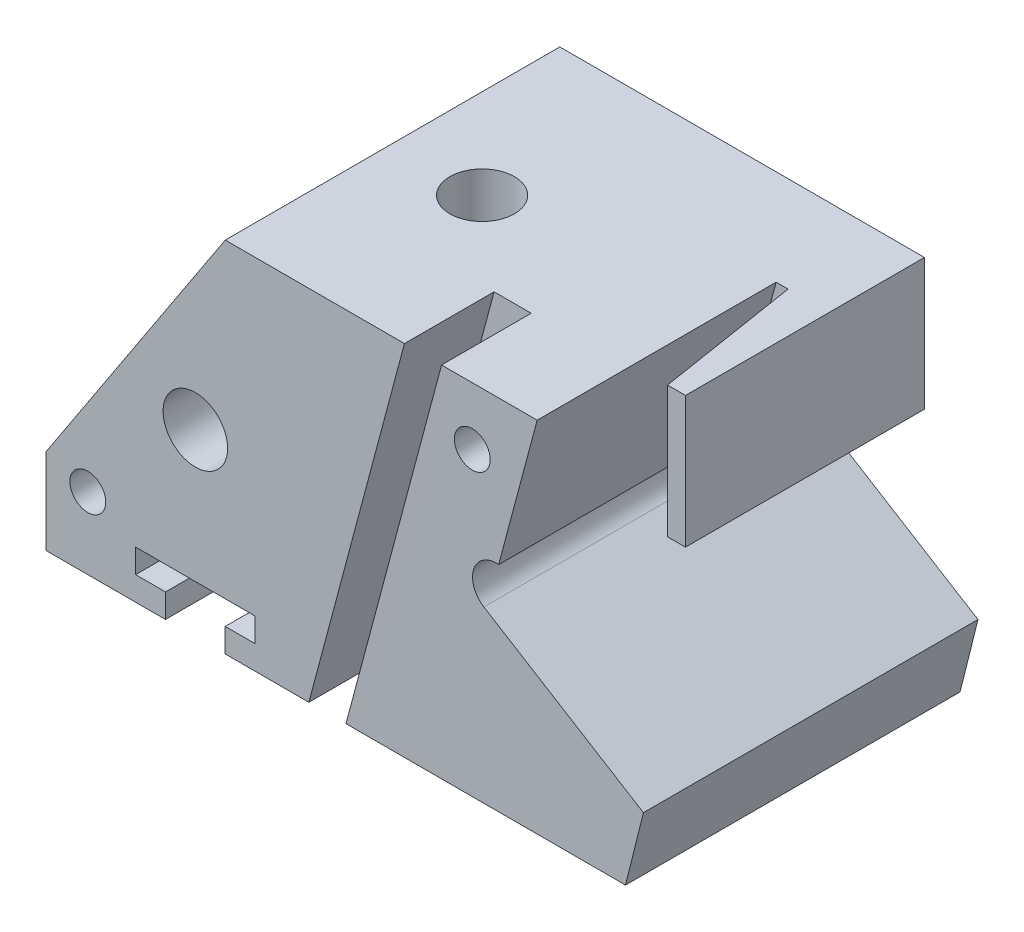
ISO-10303-21;
HEADER;
FILE_DESCRIPTION(('STEP AP214'),'2;1');
FILE_NAME('part.step','',(''),(''),'','','');
FILE_SCHEMA(('AUTOMOTIVE_DESIGN { 1 0 10303 214 1 1 1 1 }'));
ENDSEC;
DATA;
#1=APPLICATION_CONTEXT('core data for automotive mechanical design processes');
#2=APPLICATION_PROTOCOL_DEFINITION('international standard','automotive_design',2000,#1);
#3=PRODUCT_CONTEXT('',#1,'mechanical');
#4=PRODUCT('Part','Part','',(#3));
#5=PRODUCT_RELATED_PRODUCT_CATEGORY('part','',(#4));
#6=PRODUCT_DEFINITION_FORMATION('','',#4);
#7=PRODUCT_DEFINITION_CONTEXT('part definition',#1,'design');
#8=PRODUCT_DEFINITION('design','',#6,#7);
#9=PRODUCT_DEFINITION_SHAPE('','',#8);
#10=(LENGTH_UNIT() NAMED_UNIT(*) SI_UNIT(.MILLI.,.METRE.));
#11=(NAMED_UNIT(*) PLANE_ANGLE_UNIT() SI_UNIT($,.RADIAN.));
#12=(NAMED_UNIT(*) SI_UNIT($,.STERADIAN.) SOLID_ANGLE_UNIT());
#13=UNCERTAINTY_MEASURE_WITH_UNIT(LENGTH_MEASURE(1.E-05),#10,'distance_accuracy_value','');
#14=(GEOMETRIC_REPRESENTATION_CONTEXT(3) GLOBAL_UNCERTAINTY_ASSIGNED_CONTEXT((#13)) GLOBAL_UNIT_ASSIGNED_CONTEXT((#10,
#11,#12)) REPRESENTATION_CONTEXT('',''));
#15=CARTESIAN_POINT('',(0.,0.,0.));
#16=DIRECTION('',(0.,0.,1.));
#17=DIRECTION('',(1.,0.,0.));
#18=AXIS2_PLACEMENT_3D('',#15,#16,#17);
#19=CARTESIAN_POINT('',(0.,58.6840760891297,-56.));
#20=DIRECTION('',(0.,-1.,0.));
#21=DIRECTION('',(0.,0.,-1.));
#22=AXIS2_PLACEMENT_3D('',#19,#20,#21);
#23=PLANE('',#22);
#24=DIRECTION('',(-1.,0.,0.));
#25=VECTOR('',#24,1.);
#26=CARTESIAN_POINT('',(-36.1773474609924,58.6840760891297,-40.));
#27=LINE('',#26,#25);
#28=CARTESIAN_POINT('',(-36.1773474609924,58.6840760891297,-40.));
#29=VERTEX_POINT('',#28);
#30=CARTESIAN_POINT('',(-44.044014127659,58.6840760891297,-40.));
#31=VERTEX_POINT('',#30);
#32=EDGE_CURVE('E550',#29,#31,#27,.T.);
#33=ORIENTED_EDGE('',*,*,#32,.T.);
#34=DIRECTION('',(0.,0.,1.));
#35=VECTOR('',#34,1.);
#36=CARTESIAN_POINT('',(-44.044014127659,58.6840760891297,-56.));
#37=LINE('',#36,#35);
#38=CARTESIAN_POINT('',(-44.044014127659,58.6840760891297,-56.));
#39=VERTEX_POINT('',#38);
#40=EDGE_CURVE('E219',#39,#31,#37,.T.);
#41=ORIENTED_EDGE('',*,*,#40,.F.);
#42=DIRECTION('',(1.,0.,0.));
#43=VECTOR('',#42,1.);
#44=CARTESIAN_POINT('',(0.,58.6840760891297,-56.));
#45=LINE('',#44,#43);
#46=CARTESIAN_POINT('',(-29.3509749201579,58.6840760891297,-56.));
#47=VERTEX_POINT('',#46);
#48=EDGE_CURVE('E67',#39,#47,#45,.T.);
#49=ORIENTED_EDGE('',*,*,#48,.T.);
#50=DIRECTION('',(0.,0.,1.));
#51=VECTOR('',#50,1.);
#52=CARTESIAN_POINT('',(-29.3509749201579,58.6840760891297,-56.));
#53=LINE('',#52,#51);
#54=CARTESIAN_POINT('',(-29.3509749201579,58.6840760891297,-16.));
#55=VERTEX_POINT('',#54);
#56=EDGE_CURVE('E258',#47,#55,#53,.T.);
#57=ORIENTED_EDGE('',*,*,#56,.T.);
#58=DIRECTION('',(-1.,0.,0.));
#59=VECTOR('',#58,1.);
#60=CARTESIAN_POINT('',(-29.3509749201579,58.6840760891297,-16.));
#61=LINE('',#60,#59);
#62=CARTESIAN_POINT('',(-32.3509749201579,58.6840760891297,-16.));
#63=VERTEX_POINT('',#62);
#64=EDGE_CURVE('E59',#55,#63,#61,.T.);
#65=ORIENTED_EDGE('',*,*,#64,.T.);
#66=DIRECTION('',(-0.157443744207522,0.,-0.98752795778647));
#67=VECTOR('',#66,1.);
#68=CARTESIAN_POINT('',(-32.3509749201579,58.6840760891297,-16.));
#69=LINE('',#68,#67);
#70=EDGE_CURVE('E222',#63,#29,#69,.T.);
#71=ORIENTED_EDGE('',*,*,#70,.T.);
#72=EDGE_LOOP('',(#33,#41,#49,#57,#65,#71));
#73=FACE_BOUND('',#72,.T.);
#74=ADVANCED_FACE('F41',(#73),#23,.T.);
#75=CARTESIAN_POINT('',(0.,0.,0.));
#76=DIRECTION('',(0.,0.,1.));
#77=DIRECTION('',(1.,0.,0.));
#78=AXIS2_PLACEMENT_3D('',#75,#76,#77);
#79=PLANE('',#78);
#80=CARTESIAN_POINT('',(-49.033533804601,71.0217266931172,0.));
#81=DIRECTION('',(0.,0.,1.));
#82=DIRECTION('',(1.,0.,0.));
#83=AXIS2_PLACEMENT_3D('',#80,#81,#82);
#84=CIRCLE('',#83,2.99999999999999);
#85=CARTESIAN_POINT('',(-46.033533804601,71.0217266931172,0.));
#86=VERTEX_POINT('',#85);
#87=EDGE_CURVE('E867',#86,#86,#84,.T.);
#88=ORIENTED_EDGE('',*,*,#87,.F.);
#89=EDGE_LOOP('',(#88));
#90=FACE_BOUND('',#89,.T.);
#91=DIRECTION('',(-0.257662650560332,-0.966234939601246,0.));
#92=VECTOR('',#91,1.);
#93=CARTESIAN_POINT('',(-55.7300736268509,14.8613529671602,0.));
#94=LINE('',#93,#92);
#95=CARTESIAN_POINT('',(-38.1773474609924,80.6840760891297,0.));
#96=VERTEX_POINT('',#95);
#97=CARTESIAN_POINT('',(-44.6189137250007,56.5282025990985,0.));
#98=VERTEX_POINT('',#97);
#99=EDGE_CURVE('E386',#96,#98,#94,.T.);
#100=ORIENTED_EDGE('',*,*,#99,.F.);
#101=DIRECTION('',(1.,0.,0.));
#102=VECTOR('',#101,1.);
#103=CARTESIAN_POINT('',(0.,80.6840760891297,0.));
#104=LINE('',#103,#102);
#105=CARTESIAN_POINT('',(-54.1773474609924,80.6840760891297,0.));
#106=VERTEX_POINT('',#105);
#107=EDGE_CURVE('E239',#106,#96,#104,.T.);
#108=ORIENTED_EDGE('',*,*,#107,.F.);
#109=DIRECTION('',(-0.257662650560332,-0.966234939601246,0.));
#110=VECTOR('',#109,1.);
#111=CARTESIAN_POINT('',(-70.6678329629505,18.8447554567868,0.));
#112=LINE('',#111,#110);
#113=CARTESIAN_POINT('',(-70.1773474609924,20.6840760891297,0.));
#114=VERTEX_POINT('',#113);
#115=EDGE_CURVE('E276',#106,#114,#112,.T.);
#116=ORIENTED_EDGE('',*,*,#115,.T.);
#117=DIRECTION('',(1.,0.,0.));
#118=VECTOR('',#117,1.);
#119=CARTESIAN_POINT('',(0.,20.6840760891297,0.));
#120=LINE('',#119,#118);
#121=CARTESIAN_POINT('',(-23.3870173394964,20.6840760891297,0.));
#122=VERTEX_POINT('',#121);
#123=EDGE_CURVE('E369',#114,#122,#120,.T.);
#124=ORIENTED_EDGE('',*,*,#123,.T.);
#125=DIRECTION('',(0.242535625036333,0.970142500145332,0.));
#126=VECTOR('',#125,1.);
#127=CARTESIAN_POINT('',(-26.8781518699095,6.71953796747736,0.));
#128=LINE('',#127,#126);
#129=CARTESIAN_POINT('',(-20.3870173394964,32.6840760891297,0.));
#130=VERTEX_POINT('',#129);
#131=EDGE_CURVE('E374',#122,#130,#128,.T.);
#132=ORIENTED_EDGE('',*,*,#131,.T.);
#133=DIRECTION('',(-0.851357419747515,0.524586069049545,0.));
#134=VECTOR('',#133,1.);
#135=CARTESIAN_POINT('',(8.98672874869625,14.5846766638751,0.));
#136=LINE('',#135,#134);
#137=CARTESIAN_POINT('',(-47.0945264642916,49.1406041006389,0.));
#138=VERTEX_POINT('',#137);
#139=EDGE_CURVE('E378',#130,#138,#136,.T.);
#140=ORIENTED_EDGE('',*,*,#139,.T.);
#141=CARTESIAN_POINT('',(-44.9961821880934,52.5460337796289,0.));
#142=DIRECTION('',(0.,0.,1.));
#143=DIRECTION('',(1.,0.,0.));
#144=AXIS2_PLACEMENT_3D('',#141,#142,#143);
#145=CIRCLE('',#144,4.);
#146=EDGE_CURVE('E382',#98,#138,#145,.T.);
#147=ORIENTED_EDGE('',*,*,#146,.F.);
#148=EDGE_LOOP('',(#100,#108,#116,#124,#132,#140,#147));
#149=FACE_BOUND('',#148,.T.);
#150=ADVANCED_FACE('F493',(#90,#149),#79,.T.);
#151=CARTESIAN_POINT('',(-90.3870173394964,0.,-56.));
#152=DIRECTION('',(-1.,0.,0.));
#153=DIRECTION('',(0.,0.,1.));
#154=AXIS2_PLACEMENT_3D('',#151,#152,#153);
#155=PLANE('',#154);
#156=DIRECTION('',(0.,-1.,0.));
#157=VECTOR('',#156,1.);
#158=CARTESIAN_POINT('',(-90.3870173394964,0.,0.));
#159=LINE('',#158,#157);
#160=CARTESIAN_POINT('',(-90.3870173394964,24.6840760891297,0.));
#161=VERTEX_POINT('',#160);
#162=CARTESIAN_POINT('',(-90.3870173394964,20.6840760891297,0.));
#163=VERTEX_POINT('',#162);
#164=EDGE_CURVE('E296',#161,#163,#159,.T.);
#165=ORIENTED_EDGE('',*,*,#164,.F.);
#166=DIRECTION('',(0.,0.,1.));
#167=VECTOR('',#166,1.);
#168=CARTESIAN_POINT('',(-90.3870173394964,24.6840760891297,-56.));
#169=LINE('',#168,#167);
#170=CARTESIAN_POINT('',(-90.3870173394964,24.6840760891297,-56.));
#171=VERTEX_POINT('',#170);
#172=EDGE_CURVE('E11',#171,#161,#169,.T.);
#173=ORIENTED_EDGE('',*,*,#172,.F.);
#174=DIRECTION('',(0.,-1.,0.));
#175=VECTOR('',#174,1.);
#176=CARTESIAN_POINT('',(-90.3870173394964,0.,-56.));
#177=LINE('',#176,#175);
#178=CARTESIAN_POINT('',(-90.3870173394964,20.6840760891297,-56.));
#179=VERTEX_POINT('',#178);
#180=EDGE_CURVE('E306',#171,#179,#177,.T.);
#181=ORIENTED_EDGE('',*,*,#180,.T.);
#182=DIRECTION('',(0.,0.,1.));
#183=VECTOR('',#182,1.);
#184=CARTESIAN_POINT('',(-90.3870173394964,20.6840760891297,-56.));
#185=LINE('',#184,#183);
#186=EDGE_CURVE('E45',#179,#163,#185,.T.);
#187=ORIENTED_EDGE('',*,*,#186,.T.);
#188=EDGE_LOOP('',(#165,#173,#181,#187));
#189=FACE_BOUND('',#188,.T.);
#190=ADVANCED_FACE('F43',(#189),#155,.T.);
#191=CARTESIAN_POINT('',(0.,24.6840760891297,-56.));
#192=DIRECTION('',(0.,1.,0.));
#193=DIRECTION('',(0.,0.,1.));
#194=AXIS2_PLACEMENT_3D('',#191,#192,#193);
#195=PLANE('',#194);
#196=DIRECTION('',(-1.,0.,0.));
#197=VECTOR('',#196,1.);
#198=CARTESIAN_POINT('',(0.,24.6840760891297,0.));
#199=LINE('',#198,#197);
#200=CARTESIAN_POINT('',(-85.3870173394964,24.6840760891297,0.));
#201=VERTEX_POINT('',#200);
#202=EDGE_CURVE('E311',#201,#161,#199,.T.);
#203=ORIENTED_EDGE('',*,*,#202,.F.);
#204=DIRECTION('',(0.,0.,1.));
#205=VECTOR('',#204,1.);
#206=CARTESIAN_POINT('',(-85.3870173394964,24.6840760891297,-56.));
#207=LINE('',#206,#205);
#208=CARTESIAN_POINT('',(-85.3870173394964,24.6840760891297,-56.));
#209=VERTEX_POINT('',#208);
#210=EDGE_CURVE('E51',#209,#201,#207,.T.);
#211=ORIENTED_EDGE('',*,*,#210,.F.);
#212=DIRECTION('',(-1.,0.,0.));
#213=VECTOR('',#212,1.);
#214=CARTESIAN_POINT('',(0.,24.6840760891297,-56.));
#215=LINE('',#214,#213);
#216=EDGE_CURVE('E362',#209,#171,#215,.T.);
#217=ORIENTED_EDGE('',*,*,#216,.T.);
#218=ORIENTED_EDGE('',*,*,#172,.T.);
#219=EDGE_LOOP('',(#203,#211,#217,#218));
#220=FACE_BOUND('',#219,.T.);
#221=ADVANCED_FACE('F483',(#220),#195,.T.);
#222=CARTESIAN_POINT('',(-85.3870173394963,-2.96245727044926E-13,-56.));
#223=DIRECTION('',(-1.,0.,0.));
#224=DIRECTION('',(0.,-1.,0.));
#225=AXIS2_PLACEMENT_3D('',#222,#223,#224);
#226=PLANE('',#225);
#227=DIRECTION('',(0.,-1.,0.));
#228=VECTOR('',#227,1.);
#229=CARTESIAN_POINT('',(-85.3870173394963,-2.96245727044926E-13,0.));
#230=LINE('',#229,#228);
#231=CARTESIAN_POINT('',(-85.3870173394964,28.6840760891297,0.));
#232=VERTEX_POINT('',#231);
#233=EDGE_CURVE('E419',#232,#201,#230,.T.);
#234=ORIENTED_EDGE('',*,*,#233,.F.);
#235=DIRECTION('',(0.,0.,1.));
#236=VECTOR('',#235,1.);
#237=CARTESIAN_POINT('',(-85.3870173394964,28.6840760891297,-56.));
#238=LINE('',#237,#236);
#239=CARTESIAN_POINT('',(-85.3870173394964,28.6840760891297,-56.));
#240=VERTEX_POINT('',#239);
#241=EDGE_CURVE('E428',#240,#232,#238,.T.);
#242=ORIENTED_EDGE('',*,*,#241,.F.);
#243=DIRECTION('',(0.,-1.,0.));
#244=VECTOR('',#243,1.);
#245=CARTESIAN_POINT('',(-85.3870173394963,-2.96245727044926E-13,-56.));
#246=LINE('',#245,#244);
#247=EDGE_CURVE('E358',#240,#209,#246,.T.);
#248=ORIENTED_EDGE('',*,*,#247,.T.);
#249=ORIENTED_EDGE('',*,*,#210,.T.);
#250=EDGE_LOOP('',(#234,#242,#248,#249));
#251=FACE_BOUND('',#250,.T.);
#252=ADVANCED_FACE('F540',(#251),#226,.T.);
#253=CARTESIAN_POINT('',(0.,28.6840760891297,-56.));
#254=DIRECTION('',(0.,-1.,0.));
#255=DIRECTION('',(1.,0.,0.));
#256=AXIS2_PLACEMENT_3D('',#253,#254,#255);
#257=PLANE('',#256);
#258=DIRECTION('',(1.,0.,0.));
#259=VECTOR('',#258,1.);
#260=CARTESIAN_POINT('',(0.,28.6840760891297,0.));
#261=LINE('',#260,#259);
#262=CARTESIAN_POINT('',(-105.387017339496,28.6840760891297,0.));
#263=VERTEX_POINT('',#262);
#264=EDGE_CURVE('E415',#263,#232,#261,.T.);
#265=ORIENTED_EDGE('',*,*,#264,.F.);
#266=DIRECTION('',(0.,0.,1.));
#267=VECTOR('',#266,1.);
#268=CARTESIAN_POINT('',(-105.387017339496,28.6840760891297,-56.));
#269=LINE('',#268,#267);
#270=CARTESIAN_POINT('',(-105.387017339496,28.6840760891297,-56.));
#271=VERTEX_POINT('',#270);
#272=EDGE_CURVE('E431',#271,#263,#269,.T.);
#273=ORIENTED_EDGE('',*,*,#272,.F.);
#274=DIRECTION('',(1.,0.,0.));
#275=VECTOR('',#274,1.);
#276=CARTESIAN_POINT('',(0.,28.6840760891297,-56.));
#277=LINE('',#276,#275);
#278=EDGE_CURVE('E354',#271,#240,#277,.T.);
#279=ORIENTED_EDGE('',*,*,#278,.T.);
#280=ORIENTED_EDGE('',*,*,#241,.T.);
#281=EDGE_LOOP('',(#265,#273,#279,#280));
#282=FACE_BOUND('',#281,.T.);
#283=ADVANCED_FACE('F537',(#282),#257,.T.);
#284=CARTESIAN_POINT('',(-105.387017339496,3.65634666083999E-13,-56.));
#285=DIRECTION('',(1.,0.,0.));
#286=DIRECTION('',(0.,1.,0.));
#287=AXIS2_PLACEMENT_3D('',#284,#285,#286);
#288=PLANE('',#287);
#289=DIRECTION('',(0.,1.,0.));
#290=VECTOR('',#289,1.);
#291=CARTESIAN_POINT('',(-105.387017339496,3.65634666083999E-13,0.));
#292=LINE('',#291,#290);
#293=CARTESIAN_POINT('',(-105.387017339496,24.6840760891297,0.));
#294=VERTEX_POINT('',#293);
#295=EDGE_CURVE('E411',#294,#263,#292,.T.);
#296=ORIENTED_EDGE('',*,*,#295,.F.);
#297=DIRECTION('',(0.,0.,1.));
#298=VECTOR('',#297,1.);
#299=CARTESIAN_POINT('',(-105.387017339496,24.6840760891297,-56.));
#300=LINE('',#299,#298);
#301=CARTESIAN_POINT('',(-105.387017339496,24.6840760891297,-56.));
#302=VERTEX_POINT('',#301);
#303=EDGE_CURVE('E434',#302,#294,#300,.T.);
#304=ORIENTED_EDGE('',*,*,#303,.F.);
#305=DIRECTION('',(0.,1.,0.));
#306=VECTOR('',#305,1.);
#307=CARTESIAN_POINT('',(-105.387017339496,3.65634666083999E-13,-56.));
#308=LINE('',#307,#306);
#309=EDGE_CURVE('E350',#302,#271,#308,.T.);
#310=ORIENTED_EDGE('',*,*,#309,.T.);
#311=ORIENTED_EDGE('',*,*,#272,.T.);
#312=EDGE_LOOP('',(#296,#304,#310,#311));
#313=FACE_BOUND('',#312,.T.);
#314=ADVANCED_FACE('F534',(#313),#288,.T.);
#315=CARTESIAN_POINT('',(0.,24.6840760891297,-56.));
#316=DIRECTION('',(0.,1.,0.));
#317=DIRECTION('',(0.,0.,1.));
#318=AXIS2_PLACEMENT_3D('',#315,#316,#317);
#319=PLANE('',#318);
#320=DIRECTION('',(-1.,0.,0.));
#321=VECTOR('',#320,1.);
#322=CARTESIAN_POINT('',(0.,24.6840760891297,0.));
#323=LINE('',#322,#321);
#324=CARTESIAN_POINT('',(-100.387017339496,24.6840760891297,0.));
#325=VERTEX_POINT('',#324);
#326=EDGE_CURVE('E407',#325,#294,#323,.T.);
#327=ORIENTED_EDGE('',*,*,#326,.F.);
#328=DIRECTION('',(0.,0.,1.));
#329=VECTOR('',#328,1.);
#330=CARTESIAN_POINT('',(-100.387017339496,24.6840760891297,-56.));
#331=LINE('',#330,#329);
#332=CARTESIAN_POINT('',(-100.387017339496,24.6840760891297,-56.));
#333=VERTEX_POINT('',#332);
#334=EDGE_CURVE('E437',#333,#325,#331,.T.);
#335=ORIENTED_EDGE('',*,*,#334,.F.);
#336=DIRECTION('',(-1.,0.,0.));
#337=VECTOR('',#336,1.);
#338=CARTESIAN_POINT('',(0.,24.6840760891297,-56.));
#339=LINE('',#338,#337);
#340=EDGE_CURVE('E346',#333,#302,#339,.T.);
#341=ORIENTED_EDGE('',*,*,#340,.T.);
#342=ORIENTED_EDGE('',*,*,#303,.T.);
#343=EDGE_LOOP('',(#327,#335,#341,#342));
#344=FACE_BOUND('',#343,.T.);
#345=ADVANCED_FACE('F530',(#344),#319,.T.);
#346=CARTESIAN_POINT('',(-100.387017339496,0.,-56.));
#347=DIRECTION('',(1.,0.,0.));
#348=DIRECTION('',(0.,0.,-1.));
#349=AXIS2_PLACEMENT_3D('',#346,#347,#348);
#350=PLANE('',#349);
#351=DIRECTION('',(0.,1.,0.));
#352=VECTOR('',#351,1.);
#353=CARTESIAN_POINT('',(-100.387017339496,0.,0.));
#354=LINE('',#353,#352);
#355=CARTESIAN_POINT('',(-100.387017339496,20.6840760891297,0.));
#356=VERTEX_POINT('',#355);
#357=EDGE_CURVE('E403',#356,#325,#354,.T.);
#358=ORIENTED_EDGE('',*,*,#357,.F.);
#359=DIRECTION('',(0.,0.,1.));
#360=VECTOR('',#359,1.);
#361=CARTESIAN_POINT('',(-100.387017339496,20.6840760891297,-56.));
#362=LINE('',#361,#360);
#363=CARTESIAN_POINT('',(-100.387017339496,20.6840760891297,-56.));
#364=VERTEX_POINT('',#363);
#365=EDGE_CURVE('E440',#364,#356,#362,.T.);
#366=ORIENTED_EDGE('',*,*,#365,.F.);
#367=DIRECTION('',(0.,1.,0.));
#368=VECTOR('',#367,1.);
#369=CARTESIAN_POINT('',(-100.387017339496,0.,-56.));
#370=LINE('',#369,#368);
#371=EDGE_CURVE('E342',#364,#333,#370,.T.);
#372=ORIENTED_EDGE('',*,*,#371,.T.);
#373=ORIENTED_EDGE('',*,*,#334,.T.);
#374=EDGE_LOOP('',(#358,#366,#372,#373));
#375=FACE_BOUND('',#374,.T.);
#376=ADVANCED_FACE('F526',(#375),#350,.T.);
#377=CARTESIAN_POINT('',(0.,20.6840760891297,-56.));
#378=DIRECTION('',(0.,-1.,0.));
#379=DIRECTION('',(0.,0.,-1.));
#380=AXIS2_PLACEMENT_3D('',#377,#378,#379);
#381=PLANE('',#380);
#382=DIRECTION('',(1.,0.,0.));
#383=VECTOR('',#382,1.);
#384=CARTESIAN_POINT('',(0.,20.6840760891297,0.));
#385=LINE('',#384,#383);
#386=CARTESIAN_POINT('',(-120.387017339496,20.6840760891297,0.));
#387=VERTEX_POINT('',#386);
#388=EDGE_CURVE('E399',#387,#356,#385,.T.);
#389=ORIENTED_EDGE('',*,*,#388,.F.);
#390=DIRECTION('',(0.,0.,1.));
#391=VECTOR('',#390,1.);
#392=CARTESIAN_POINT('',(-120.387017339496,20.6840760891297,-56.));
#393=LINE('',#392,#391);
#394=CARTESIAN_POINT('',(-120.387017339496,20.6840760891297,-56.));
#395=VERTEX_POINT('',#394);
#396=EDGE_CURVE('E443',#395,#387,#393,.T.);
#397=ORIENTED_EDGE('',*,*,#396,.F.);
#398=DIRECTION('',(1.,0.,0.));
#399=VECTOR('',#398,1.);
#400=CARTESIAN_POINT('',(0.,20.6840760891297,-56.));
#401=LINE('',#400,#399);
#402=EDGE_CURVE('E338',#395,#364,#401,.T.);
#403=ORIENTED_EDGE('',*,*,#402,.T.);
#404=ORIENTED_EDGE('',*,*,#365,.T.);
#405=EDGE_LOOP('',(#389,#397,#403,#404));
#406=FACE_BOUND('',#405,.T.);
#407=ADVANCED_FACE('F522',(#406),#381,.T.);
#408=CARTESIAN_POINT('',(-120.387017339496,0.,-56.));
#409=DIRECTION('',(1.,0.,0.));
#410=DIRECTION('',(0.,0.,-1.));
#411=AXIS2_PLACEMENT_3D('',#408,#409,#410);
#412=PLANE('',#411);
#413=DIRECTION('',(0.,1.,0.));
#414=VECTOR('',#413,1.);
#415=CARTESIAN_POINT('',(-120.387017339496,0.,0.));
#416=LINE('',#415,#414);
#417=CARTESIAN_POINT('',(-120.387017339496,35.0037245868569,0.));
#418=VERTEX_POINT('',#417);
#419=EDGE_CURVE('E396',#387,#418,#416,.T.);
#420=ORIENTED_EDGE('',*,*,#419,.T.);
#421=DIRECTION('',(0.,0.,1.));
#422=VECTOR('',#421,1.);
#423=CARTESIAN_POINT('',(-120.387017339496,35.0037245868569,-56.));
#424=LINE('',#423,#422);
#425=CARTESIAN_POINT('',(-120.387017339496,35.0037245868569,-56.));
#426=VERTEX_POINT('',#425);
#427=EDGE_CURVE('E446',#426,#418,#424,.T.);
#428=ORIENTED_EDGE('',*,*,#427,.F.);
#429=DIRECTION('',(0.,1.,0.));
#430=VECTOR('',#429,1.);
#431=CARTESIAN_POINT('',(-120.387017339496,0.,-56.));
#432=LINE('',#431,#430);
#433=EDGE_CURVE('E335',#395,#426,#432,.T.);
#434=ORIENTED_EDGE('',*,*,#433,.F.);
#435=ORIENTED_EDGE('',*,*,#396,.T.);
#436=EDGE_LOOP('',(#420,#428,#434,#435));
#437=FACE_BOUND('',#436,.T.);
#438=ADVANCED_FACE('F519',(#437),#412,.F.);
#439=CARTESIAN_POINT('',(-100.171075586919,65.7861020937643,-56.));
#440=DIRECTION('',(0.835860947675269,-0.548941231965135,0.));
#441=DIRECTION('',(0.548941231965136,0.835860947675269,0.));
#442=AXIS2_PLACEMENT_3D('',#439,#440,#441);
#443=PLANE('',#442);
#444=DIRECTION('',(0.548941231965136,0.835860947675269,0.));
#445=VECTOR('',#444,1.);
#446=CARTESIAN_POINT('',(-100.171075586919,65.7861020937643,0.));
#447=LINE('',#446,#445);
#448=CARTESIAN_POINT('',(-90.3870173394964,80.6840760891297,0.));
#449=VERTEX_POINT('',#448);
#450=EDGE_CURVE('E393',#418,#449,#447,.T.);
#451=ORIENTED_EDGE('',*,*,#450,.T.);
#452=DIRECTION('',(0.,0.,1.));
#453=VECTOR('',#452,1.);
#454=CARTESIAN_POINT('',(-90.3870173394964,80.6840760891297,-56.));
#455=LINE('',#454,#453);
#456=CARTESIAN_POINT('',(-90.3870173394964,80.6840760891297,-56.));
#457=VERTEX_POINT('',#456);
#458=EDGE_CURVE('E450',#457,#449,#455,.T.);
#459=ORIENTED_EDGE('',*,*,#458,.F.);
#460=DIRECTION('',(0.548941231965136,0.835860947675269,0.));
#461=VECTOR('',#460,1.);
#462=CARTESIAN_POINT('',(-100.171075586919,65.7861020937643,-56.));
#463=LINE('',#462,#461);
#464=EDGE_CURVE('E332',#426,#457,#463,.T.);
#465=ORIENTED_EDGE('',*,*,#464,.F.);
#466=ORIENTED_EDGE('',*,*,#427,.T.);
#467=EDGE_LOOP('',(#451,#459,#465,#466));
#468=FACE_BOUND('',#467,.T.);
#469=ADVANCED_FACE('F514',(#468),#443,.F.);
#470=CARTESIAN_POINT('',(0.,80.6840760891297,-56.));
#471=DIRECTION('',(0.,-1.,0.));
#472=DIRECTION('',(0.,0.,-1.));
#473=AXIS2_PLACEMENT_3D('',#470,#471,#472);
#474=PLANE('',#473);
#475=CARTESIAN_POINT('',(-75.3870173394964,80.6840760891297,-28.));
#476=DIRECTION('',(0.,1.,0.));
#477=DIRECTION('',(0.,0.,1.));
#478=AXIS2_PLACEMENT_3D('',#475,#476,#477);
#479=CIRCLE('',#478,5.39999999999999);
#480=CARTESIAN_POINT('',(-75.3870173394964,80.6840760891297,-22.6));
#481=VERTEX_POINT('',#480);
#482=EDGE_CURVE('E868',#481,#481,#479,.T.);
#483=ORIENTED_EDGE('',*,*,#482,.F.);
#484=EDGE_LOOP('',(#483));
#485=FACE_BOUND('',#484,.T.);
#486=DIRECTION('',(-0.157443744207522,0.,-0.98752795778647));
#487=VECTOR('',#486,1.);
#488=CARTESIAN_POINT('',(-32.3509749201579,80.6840760891297,-16.));
#489=LINE('',#488,#487);
#490=CARTESIAN_POINT('',(-32.3509749201579,80.6840760891297,-16.));
#491=VERTEX_POINT('',#490);
#492=CARTESIAN_POINT('',(-36.1773474609924,80.6840760891297,-40.));
#493=VERTEX_POINT('',#492);
#494=EDGE_CURVE('E234',#491,#493,#489,.T.);
#495=ORIENTED_EDGE('',*,*,#494,.F.);
#496=DIRECTION('',(-1.,0.,0.));
#497=VECTOR('',#496,1.);
#498=CARTESIAN_POINT('',(-29.3509749201579,80.6840760891297,-16.));
#499=LINE('',#498,#497);
#500=CARTESIAN_POINT('',(-29.3509749201579,80.6840760891297,-16.));
#501=VERTEX_POINT('',#500);
#502=EDGE_CURVE('E544',#501,#491,#499,.T.);
#503=ORIENTED_EDGE('',*,*,#502,.F.);
#504=DIRECTION('',(0.,0.,1.));
#505=VECTOR('',#504,1.);
#506=CARTESIAN_POINT('',(-29.3509749201579,80.6840760891297,-56.));
#507=LINE('',#506,#505);
#508=CARTESIAN_POINT('',(-29.3509749201579,80.6840760891297,-56.));
#509=VERTEX_POINT('',#508);
#510=EDGE_CURVE('E259',#509,#501,#507,.T.);
#511=ORIENTED_EDGE('',*,*,#510,.F.);
#512=DIRECTION('',(1.,0.,0.));
#513=VECTOR('',#512,1.);
#514=CARTESIAN_POINT('',(0.,80.6840760891297,-56.));
#515=LINE('',#514,#513);
#516=EDGE_CURVE('E329',#457,#509,#515,.T.);
#517=ORIENTED_EDGE('',*,*,#516,.F.);
#518=ORIENTED_EDGE('',*,*,#458,.T.);
#519=CARTESIAN_POINT('',(-60.3870173394964,80.6840760891297,0.));
#520=VERTEX_POINT('',#519);
#521=EDGE_CURVE('E389',#449,#520,#104,.T.);
#522=ORIENTED_EDGE('',*,*,#521,.T.);
#523=DIRECTION('',(0.,0.,1.));
#524=VECTOR('',#523,1.);
#525=CARTESIAN_POINT('',(-60.3870173394964,80.6840760891297,-15.));
#526=LINE('',#525,#524);
#527=CARTESIAN_POINT('',(-60.3870173394964,80.6840760891297,-15.));
#528=VERTEX_POINT('',#527);
#529=EDGE_CURVE('E293',#528,#520,#526,.T.);
#530=ORIENTED_EDGE('',*,*,#529,.F.);
#531=DIRECTION('',(1.,0.,0.));
#532=VECTOR('',#531,1.);
#533=CARTESIAN_POINT('',(0.,80.6840760891297,-15.));
#534=LINE('',#533,#532);
#535=CARTESIAN_POINT('',(-54.1773474609924,80.6840760891297,-15.));
#536=VERTEX_POINT('',#535);
#537=EDGE_CURVE('E283',#528,#536,#534,.T.);
#538=ORIENTED_EDGE('',*,*,#537,.T.);
#539=DIRECTION('',(0.,0.,1.));
#540=VECTOR('',#539,1.);
#541=CARTESIAN_POINT('',(-54.1773474609924,80.6840760891297,-15.));
#542=LINE('',#541,#540);
#543=EDGE_CURVE('E297',#536,#106,#542,.T.);
#544=ORIENTED_EDGE('',*,*,#543,.T.);
#545=ORIENTED_EDGE('',*,*,#107,.T.);
#546=DIRECTION('',(0.,0.,1.));
#547=VECTOR('',#546,1.);
#548=CARTESIAN_POINT('',(-38.1773474609924,80.6840760891297,-40.));
#549=LINE('',#548,#547);
#550=CARTESIAN_POINT('',(-38.1773474609924,80.6840760891297,-40.));
#551=VERTEX_POINT('',#550);
#552=EDGE_CURVE('E217',#551,#96,#549,.T.);
#553=ORIENTED_EDGE('',*,*,#552,.F.);
#554=DIRECTION('',(-1.,0.,0.));
#555=VECTOR('',#554,1.);
#556=CARTESIAN_POINT('',(-36.1773474609924,80.6840760891297,-40.));
#557=LINE('',#556,#555);
#558=EDGE_CURVE('E226',#493,#551,#557,.T.);
#559=ORIENTED_EDGE('',*,*,#558,.F.);
#560=EDGE_LOOP('',(#495,#503,#511,#517,#518,#522,#530,#538,#544,#545,#553,#559));
#561=FACE_BOUND('',#560,.T.);
#562=ADVANCED_FACE('F236',(#485,#561),#474,.F.);
#563=CARTESIAN_POINT('',(-55.7300736268509,14.8613529671602,-56.));
#564=DIRECTION('',(-0.966234939601246,0.257662650560332,0.));
#565=DIRECTION('',(-0.257662650560332,-0.966234939601246,0.));
#566=AXIS2_PLACEMENT_3D('',#563,#564,#565);
#567=PLANE('',#566);
#568=DIRECTION('',(-0.257662650560332,-0.966234939601246,0.));
#569=VECTOR('',#568,1.);
#570=CARTESIAN_POINT('',(-55.7300736268509,14.8613529671602,-56.));
#571=LINE('',#570,#569);
#572=CARTESIAN_POINT('',(-44.6189137250007,56.5282025990985,-56.));
#573=VERTEX_POINT('',#572);
#574=EDGE_CURVE('E326',#39,#573,#571,.T.);
#575=ORIENTED_EDGE('',*,*,#574,.F.);
#576=ORIENTED_EDGE('',*,*,#40,.T.);
#577=DIRECTION('',(-0.257662650560332,-0.966234939601246,0.));
#578=VECTOR('',#577,1.);
#579=CARTESIAN_POINT('',(-55.7300736268509,14.8613529671602,-40.));
#580=LINE('',#579,#578);
#581=EDGE_CURVE('E212',#551,#31,#580,.T.);
#582=ORIENTED_EDGE('',*,*,#581,.F.);
#583=ORIENTED_EDGE('',*,*,#552,.T.);
#584=ORIENTED_EDGE('',*,*,#99,.T.);
#585=DIRECTION('',(0.,0.,1.));
#586=VECTOR('',#585,1.);
#587=CARTESIAN_POINT('',(-44.6189137250007,56.5282025990985,-56.));
#588=LINE('',#587,#586);
#589=EDGE_CURVE('E454',#573,#98,#588,.T.);
#590=ORIENTED_EDGE('',*,*,#589,.F.);
#591=EDGE_LOOP('',(#575,#576,#582,#583,#584,#590));
#592=FACE_BOUND('',#591,.T.);
#593=ADVANCED_FACE('F215',(#592),#567,.F.);
#594=CARTESIAN_POINT('',(-44.9961821880934,52.5460337796289,-56.));
#595=DIRECTION('',(0.,0.,1.));
#596=DIRECTION('',(1.,0.,0.));
#597=AXIS2_PLACEMENT_3D('',#594,#595,#596);
#598=CYLINDRICAL_SURFACE('',#597,4.);
#599=ORIENTED_EDGE('',*,*,#146,.T.);
#600=DIRECTION('',(0.,0.,1.));
#601=VECTOR('',#600,1.);
#602=CARTESIAN_POINT('',(-47.0945264642916,49.1406041006389,-56.));
#603=LINE('',#602,#601);
#604=CARTESIAN_POINT('',(-47.0945264642916,49.1406041006389,-56.));
#605=VERTEX_POINT('',#604);
#606=EDGE_CURVE('E458',#605,#138,#603,.T.);
#607=ORIENTED_EDGE('',*,*,#606,.F.);
#608=CARTESIAN_POINT('',(-44.9961821880934,52.5460337796289,-56.));
#609=DIRECTION('',(0.,0.,1.));
#610=DIRECTION('',(1.,0.,0.));
#611=AXIS2_PLACEMENT_3D('',#608,#609,#610);
#612=CIRCLE('',#611,4.);
#613=EDGE_CURVE('E323',#573,#605,#612,.T.);
#614=ORIENTED_EDGE('',*,*,#613,.F.);
#615=ORIENTED_EDGE('',*,*,#589,.T.);
#616=EDGE_LOOP('',(#599,#607,#614,#615));
#617=FACE_BOUND('',#616,.T.);
#618=ADVANCED_FACE('F555',(#617),#598,.F.);
#619=CARTESIAN_POINT('',(8.98672874869625,14.5846766638751,-56.));
#620=DIRECTION('',(0.524586069049545,0.851357419747515,0.));
#621=DIRECTION('',(-0.851357419747515,0.524586069049545,0.));
#622=AXIS2_PLACEMENT_3D('',#619,#620,#621);
#623=PLANE('',#622);
#624=ORIENTED_EDGE('',*,*,#139,.F.);
#625=DIRECTION('',(0.,0.,1.));
#626=VECTOR('',#625,1.);
#627=CARTESIAN_POINT('',(-20.3870173394964,32.6840760891297,-56.));
#628=LINE('',#627,#626);
#629=CARTESIAN_POINT('',(-20.3870173394964,32.6840760891297,-56.));
#630=VERTEX_POINT('',#629);
#631=EDGE_CURVE('E461',#630,#130,#628,.T.);
#632=ORIENTED_EDGE('',*,*,#631,.F.);
#633=DIRECTION('',(-0.851357419747515,0.524586069049545,0.));
#634=VECTOR('',#633,1.);
#635=CARTESIAN_POINT('',(8.98672874869625,14.5846766638751,-56.));
#636=LINE('',#635,#634);
#637=EDGE_CURVE('E319',#630,#605,#636,.T.);
#638=ORIENTED_EDGE('',*,*,#637,.T.);
#639=ORIENTED_EDGE('',*,*,#606,.T.);
#640=EDGE_LOOP('',(#624,#632,#638,#639));
#641=FACE_BOUND('',#640,.T.);
#642=ADVANCED_FACE('F557',(#641),#623,.T.);
#643=CARTESIAN_POINT('',(-26.8781518699095,6.71953796747736,-56.));
#644=DIRECTION('',(0.970142500145332,-0.242535625036333,0.));
#645=DIRECTION('',(0.242535625036333,0.970142500145332,0.));
#646=AXIS2_PLACEMENT_3D('',#643,#644,#645);
#647=PLANE('',#646);
#648=ORIENTED_EDGE('',*,*,#131,.F.);
#649=DIRECTION('',(0.,0.,1.));
#650=VECTOR('',#649,1.);
#651=CARTESIAN_POINT('',(-23.3870173394964,20.6840760891297,-56.));
#652=LINE('',#651,#650);
#653=CARTESIAN_POINT('',(-23.3870173394964,20.6840760891297,-56.));
#654=VERTEX_POINT('',#653);
#655=EDGE_CURVE('E463',#654,#122,#652,.T.);
#656=ORIENTED_EDGE('',*,*,#655,.F.);
#657=DIRECTION('',(0.242535625036333,0.970142500145332,0.));
#658=VECTOR('',#657,1.);
#659=CARTESIAN_POINT('',(-26.8781518699095,6.71953796747736,-56.));
#660=LINE('',#659,#658);
#661=EDGE_CURVE('E315',#654,#630,#660,.T.);
#662=ORIENTED_EDGE('',*,*,#661,.T.);
#663=ORIENTED_EDGE('',*,*,#631,.T.);
#664=EDGE_LOOP('',(#648,#656,#662,#663));
#665=FACE_BOUND('',#664,.T.);
#666=ADVANCED_FACE('F490',(#665),#647,.T.);
#667=CARTESIAN_POINT('',(0.,20.6840760891297,-56.));
#668=DIRECTION('',(0.,-1.,0.));
#669=DIRECTION('',(0.,0.,-1.));
#670=AXIS2_PLACEMENT_3D('',#667,#668,#669);
#671=PLANE('',#670);
#672=CARTESIAN_POINT('',(-75.3870173394964,20.6840760891297,-28.));
#673=DIRECTION('',(0.,1.,0.));
#674=DIRECTION('',(0.,0.,1.));
#675=AXIS2_PLACEMENT_3D('',#672,#673,#674);
#676=CIRCLE('',#675,5.39999999999999);
#677=CARTESIAN_POINT('',(-75.3870173394964,20.6840760891297,-22.6));
#678=VERTEX_POINT('',#677);
#679=EDGE_CURVE('E865',#678,#678,#676,.T.);
#680=ORIENTED_EDGE('',*,*,#679,.T.);
#681=EDGE_LOOP('',(#680));
#682=FACE_BOUND('',#681,.T.);
#683=DIRECTION('',(0.,0.,1.));
#684=VECTOR('',#683,1.);
#685=CARTESIAN_POINT('',(-76.3870173394964,20.6840760891297,-15.));
#686=LINE('',#685,#684);
#687=CARTESIAN_POINT('',(-76.3870173394964,20.6840760891297,-15.));
#688=VERTEX_POINT('',#687);
#689=CARTESIAN_POINT('',(-76.3870173394964,20.6840760891297,0.));
#690=VERTEX_POINT('',#689);
#691=EDGE_CURVE('E287',#688,#690,#686,.T.);
#692=ORIENTED_EDGE('',*,*,#691,.T.);
#693=EDGE_CURVE('E370',#163,#690,#120,.T.);
#694=ORIENTED_EDGE('',*,*,#693,.F.);
#695=ORIENTED_EDGE('',*,*,#186,.F.);
#696=DIRECTION('',(1.,0.,0.));
#697=VECTOR('',#696,1.);
#698=CARTESIAN_POINT('',(0.,20.6840760891297,-56.));
#699=LINE('',#698,#697);
#700=EDGE_CURVE('E310',#179,#654,#699,.T.);
#701=ORIENTED_EDGE('',*,*,#700,.T.);
#702=ORIENTED_EDGE('',*,*,#655,.T.);
#703=ORIENTED_EDGE('',*,*,#123,.F.);
#704=DIRECTION('',(0.,0.,1.));
#705=VECTOR('',#704,1.);
#706=CARTESIAN_POINT('',(-70.1773474609924,20.6840760891297,-15.));
#707=LINE('',#706,#705);
#708=CARTESIAN_POINT('',(-70.1773474609924,20.6840760891297,-15.));
#709=VERTEX_POINT('',#708);
#710=EDGE_CURVE('E300',#709,#114,#707,.T.);
#711=ORIENTED_EDGE('',*,*,#710,.F.);
#712=DIRECTION('',(1.,0.,0.));
#713=VECTOR('',#712,1.);
#714=CARTESIAN_POINT('',(0.,20.6840760891297,-15.));
#715=LINE('',#714,#713);
#716=EDGE_CURVE('E275',#688,#709,#715,.T.);
#717=ORIENTED_EDGE('',*,*,#716,.F.);
#718=EDGE_LOOP('',(#692,#694,#695,#701,#702,#703,#711,#717));
#719=FACE_BOUND('',#718,.T.);
#720=ADVANCED_FACE('F475',(#682,#719),#671,.T.);
#721=CARTESIAN_POINT('',(0.,0.,-56.));
#722=DIRECTION('',(0.,0.,1.));
#723=DIRECTION('',(1.,0.,0.));
#724=AXIS2_PLACEMENT_3D('',#721,#722,#723);
#725=PLANE('',#724);
#726=CARTESIAN_POINT('',(-49.033533804601,71.0217266931172,-56.));
#727=DIRECTION('',(0.,0.,1.));
#728=DIRECTION('',(1.,0.,0.));
#729=AXIS2_PLACEMENT_3D('',#726,#727,#728);
#730=CIRCLE('',#729,2.99999999999999);
#731=CARTESIAN_POINT('',(-46.033533804601,71.0217266931172,-56.));
#732=VERTEX_POINT('',#731);
#733=EDGE_CURVE('E873',#732,#732,#730,.T.);
#734=ORIENTED_EDGE('',*,*,#733,.T.);
#735=EDGE_LOOP('',(#734));
#736=FACE_BOUND('',#735,.T.);
#737=CARTESIAN_POINT('',(-113.387017339496,32.6840760891297,-56.));
#738=DIRECTION('',(0.,0.,1.));
#739=DIRECTION('',(1.,0.,0.));
#740=AXIS2_PLACEMENT_3D('',#737,#738,#739);
#741=CIRCLE('',#740,2.99999999999999);
#742=CARTESIAN_POINT('',(-110.387017339496,32.6840760891297,-56.));
#743=VERTEX_POINT('',#742);
#744=EDGE_CURVE('E885',#743,#743,#741,.T.);
#745=ORIENTED_EDGE('',*,*,#744,.T.);
#746=EDGE_LOOP('',(#745));
#747=FACE_BOUND('',#746,.T.);
#748=CARTESIAN_POINT('',(-95.3870173394964,50.6840760891297,-56.));
#749=DIRECTION('',(0.,0.,1.));
#750=DIRECTION('',(1.,0.,0.));
#751=AXIS2_PLACEMENT_3D('',#748,#749,#750);
#752=CIRCLE('',#751,5.39999999999999);
#753=CARTESIAN_POINT('',(-89.9870173394964,50.6840760891297,-56.));
#754=VERTEX_POINT('',#753);
#755=EDGE_CURVE('E223',#754,#754,#752,.T.);
#756=ORIENTED_EDGE('',*,*,#755,.T.);
#757=EDGE_LOOP('',(#756));
#758=FACE_BOUND('',#757,.T.);
#759=ORIENTED_EDGE('',*,*,#180,.F.);
#760=ORIENTED_EDGE('',*,*,#216,.F.);
#761=ORIENTED_EDGE('',*,*,#247,.F.);
#762=ORIENTED_EDGE('',*,*,#278,.F.);
#763=ORIENTED_EDGE('',*,*,#309,.F.);
#764=ORIENTED_EDGE('',*,*,#340,.F.);
#765=ORIENTED_EDGE('',*,*,#371,.F.);
#766=ORIENTED_EDGE('',*,*,#402,.F.);
#767=ORIENTED_EDGE('',*,*,#433,.T.);
#768=ORIENTED_EDGE('',*,*,#464,.T.);
#769=ORIENTED_EDGE('',*,*,#516,.T.);
#770=DIRECTION('',(0.,1.,0.));
#771=VECTOR('',#770,1.);
#772=CARTESIAN_POINT('',(-29.3509749201579,0.,-56.));
#773=LINE('',#772,#771);
#774=EDGE_CURVE('E254',#47,#509,#773,.T.);
#775=ORIENTED_EDGE('',*,*,#774,.F.);
#776=ORIENTED_EDGE('',*,*,#48,.F.);
#777=ORIENTED_EDGE('',*,*,#574,.T.);
#778=ORIENTED_EDGE('',*,*,#613,.T.);
#779=ORIENTED_EDGE('',*,*,#637,.F.);
#780=ORIENTED_EDGE('',*,*,#661,.F.);
#781=ORIENTED_EDGE('',*,*,#700,.F.);
#782=EDGE_LOOP('',(#759,#760,#761,#762,#763,#764,#765,#766,#767,#768,#769,#775,#776,#777,#778,
#779,#780,#781));
#783=FACE_BOUND('',#782,.T.);
#784=ADVANCED_FACE('F485',(#736,#747,#758,#783),#725,.F.);
#785=CARTESIAN_POINT('',(-113.387017339496,32.6840760891297,0.));
#786=DIRECTION('',(0.,0.,1.));
#787=DIRECTION('',(1.,0.,0.));
#788=AXIS2_PLACEMENT_3D('',#785,#786,#787);
#789=CIRCLE('',#788,2.99999999999999);
#790=CARTESIAN_POINT('',(-110.387017339496,32.6840760891297,0.));
#791=VERTEX_POINT('',#790);
#792=EDGE_CURVE('E881',#791,#791,#789,.T.);
#793=ORIENTED_EDGE('',*,*,#792,.F.);
#794=EDGE_LOOP('',(#793));
#795=FACE_BOUND('',#794,.T.);
#796=CARTESIAN_POINT('',(-95.3870173394964,50.6840760891297,0.));
#797=DIRECTION('',(0.,0.,1.));
#798=DIRECTION('',(1.,0.,0.));
#799=AXIS2_PLACEMENT_3D('',#796,#797,#798);
#800=CIRCLE('',#799,5.39999999999999);
#801=CARTESIAN_POINT('',(-89.9870173394964,50.6840760891297,0.));
#802=VERTEX_POINT('',#801);
#803=EDGE_CURVE('E889',#802,#802,#800,.T.);
#804=ORIENTED_EDGE('',*,*,#803,.F.);
#805=EDGE_LOOP('',(#804));
#806=FACE_BOUND('',#805,.T.);
#807=DIRECTION('',(-0.257662650560332,-0.966234939601247,0.));
#808=VECTOR('',#807,1.);
#809=CARTESIAN_POINT('',(-76.465242600558,20.3907313601487,0.));
#810=LINE('',#809,#808);
#811=EDGE_CURVE('E270',#520,#690,#810,.T.);
#812=ORIENTED_EDGE('',*,*,#811,.F.);
#813=ORIENTED_EDGE('',*,*,#521,.F.);
#814=ORIENTED_EDGE('',*,*,#450,.F.);
#815=ORIENTED_EDGE('',*,*,#419,.F.);
#816=ORIENTED_EDGE('',*,*,#388,.T.);
#817=ORIENTED_EDGE('',*,*,#357,.T.);
#818=ORIENTED_EDGE('',*,*,#326,.T.);
#819=ORIENTED_EDGE('',*,*,#295,.T.);
#820=ORIENTED_EDGE('',*,*,#264,.T.);
#821=ORIENTED_EDGE('',*,*,#233,.T.);
#822=ORIENTED_EDGE('',*,*,#202,.T.);
#823=ORIENTED_EDGE('',*,*,#164,.T.);
#824=ORIENTED_EDGE('',*,*,#693,.T.);
#825=EDGE_LOOP('',(#812,#813,#814,#815,#816,#817,#818,#819,#820,#821,#822,#823,#824));
#826=FACE_BOUND('',#825,.T.);
#827=ADVANCED_FACE('F479',(#795,#806,#826),#79,.T.);
#828=CARTESIAN_POINT('',(-76.465242600558,20.3907313601487,-15.));
#829=DIRECTION('',(-0.966234939601246,0.257662650560332,0.));
#830=DIRECTION('',(-0.257662650560332,-0.966234939601247,0.));
#831=AXIS2_PLACEMENT_3D('',#828,#829,#830);
#832=PLANE('',#831);
#833=ORIENTED_EDGE('',*,*,#811,.T.);
#834=ORIENTED_EDGE('',*,*,#691,.F.);
#835=DIRECTION('',(-0.257662650560332,-0.966234939601247,0.));
#836=VECTOR('',#835,1.);
#837=CARTESIAN_POINT('',(-76.465242600558,20.3907313601487,-15.));
#838=LINE('',#837,#836);
#839=EDGE_CURVE('E271',#528,#688,#838,.T.);
#840=ORIENTED_EDGE('',*,*,#839,.F.);
#841=ORIENTED_EDGE('',*,*,#529,.T.);
#842=EDGE_LOOP('',(#833,#834,#840,#841));
#843=FACE_BOUND('',#842,.T.);
#844=ADVANCED_FACE('F506',(#843),#832,.F.);
#845=CARTESIAN_POINT('',(-70.6678329629505,18.8447554567868,-15.));
#846=DIRECTION('',(-0.966234939601246,0.257662650560332,0.));
#847=DIRECTION('',(-0.257662650560332,-0.966234939601247,0.));
#848=AXIS2_PLACEMENT_3D('',#845,#846,#847);
#849=PLANE('',#848);
#850=ORIENTED_EDGE('',*,*,#115,.F.);
#851=ORIENTED_EDGE('',*,*,#543,.F.);
#852=DIRECTION('',(-0.257662650560332,-0.966234939601246,0.));
#853=VECTOR('',#852,1.);
#854=CARTESIAN_POINT('',(-70.6678329629505,18.8447554567868,-15.));
#855=LINE('',#854,#853);
#856=EDGE_CURVE('E280',#536,#709,#855,.T.);
#857=ORIENTED_EDGE('',*,*,#856,.T.);
#858=ORIENTED_EDGE('',*,*,#710,.T.);
#859=EDGE_LOOP('',(#850,#851,#857,#858));
#860=FACE_BOUND('',#859,.T.);
#861=ADVANCED_FACE('F499',(#860),#849,.T.);
#862=CARTESIAN_POINT('',(0.,0.,-15.));
#863=DIRECTION('',(0.,0.,1.));
#864=DIRECTION('',(1.,0.,0.));
#865=AXIS2_PLACEMENT_3D('',#862,#863,#864);
#866=PLANE('',#865);
#867=ORIENTED_EDGE('',*,*,#839,.T.);
#868=ORIENTED_EDGE('',*,*,#716,.T.);
#869=ORIENTED_EDGE('',*,*,#856,.F.);
#870=ORIENTED_EDGE('',*,*,#537,.F.);
#871=EDGE_LOOP('',(#867,#868,#869,#870));
#872=FACE_BOUND('',#871,.T.);
#873=ADVANCED_FACE('F502',(#872),#866,.T.);
#874=CARTESIAN_POINT('',(-29.3509749201579,0.,-56.));
#875=DIRECTION('',(1.,0.,0.));
#876=DIRECTION('',(0.,0.,-1.));
#877=AXIS2_PLACEMENT_3D('',#874,#875,#876);
#878=PLANE('',#877);
#879=DIRECTION('',(0.,1.,0.));
#880=VECTOR('',#879,1.);
#881=CARTESIAN_POINT('',(-29.3509749201579,20.6830760891297,-16.));
#882=LINE('',#881,#880);
#883=EDGE_CURVE('E241',#55,#501,#882,.T.);
#884=ORIENTED_EDGE('',*,*,#883,.F.);
#885=ORIENTED_EDGE('',*,*,#56,.F.);
#886=ORIENTED_EDGE('',*,*,#774,.T.);
#887=ORIENTED_EDGE('',*,*,#510,.T.);
#888=EDGE_LOOP('',(#884,#885,#886,#887));
#889=FACE_BOUND('',#888,.T.);
#890=ADVANCED_FACE('F547',(#889),#878,.T.);
#891=CARTESIAN_POINT('',(-29.3509749201579,20.6830760891297,-16.));
#892=DIRECTION('',(0.,0.,-1.));
#893=DIRECTION('',(-1.,0.,0.));
#894=AXIS2_PLACEMENT_3D('',#891,#892,#893);
#895=PLANE('',#894);
#896=ORIENTED_EDGE('',*,*,#883,.T.);
#897=ORIENTED_EDGE('',*,*,#502,.T.);
#898=DIRECTION('',(0.,1.,0.));
#899=VECTOR('',#898,1.);
#900=CARTESIAN_POINT('',(-32.3509749201579,20.6830760891297,-16.));
#901=LINE('',#900,#899);
#902=EDGE_CURVE('E244',#63,#491,#901,.T.);
#903=ORIENTED_EDGE('',*,*,#902,.F.);
#904=ORIENTED_EDGE('',*,*,#64,.F.);
#905=EDGE_LOOP('',(#896,#897,#903,#904));
#906=FACE_BOUND('',#905,.T.);
#907=ADVANCED_FACE('F663',(#906),#895,.F.);
#908=CARTESIAN_POINT('',(-32.3509749201579,20.6830760891297,-16.));
#909=DIRECTION('',(0.98752795778647,0.,-0.157443744207522));
#910=DIRECTION('',(-0.157443744207522,0.,-0.98752795778647));
#911=AXIS2_PLACEMENT_3D('',#908,#909,#910);
#912=PLANE('',#911);
#913=ORIENTED_EDGE('',*,*,#902,.T.);
#914=ORIENTED_EDGE('',*,*,#494,.T.);
#915=DIRECTION('',(0.,1.,0.));
#916=VECTOR('',#915,1.);
#917=CARTESIAN_POINT('',(-36.1773474609924,20.6830760891297,-40.));
#918=LINE('',#917,#916);
#919=EDGE_CURVE('E229',#29,#493,#918,.T.);
#920=ORIENTED_EDGE('',*,*,#919,.F.);
#921=ORIENTED_EDGE('',*,*,#70,.F.);
#922=EDGE_LOOP('',(#913,#914,#920,#921));
#923=FACE_BOUND('',#922,.T.);
#924=ADVANCED_FACE('F672',(#923),#912,.F.);
#925=CARTESIAN_POINT('',(-36.1773474609924,20.6830760891297,-40.));
#926=DIRECTION('',(0.,0.,-1.));
#927=DIRECTION('',(-1.,0.,0.));
#928=AXIS2_PLACEMENT_3D('',#925,#926,#927);
#929=PLANE('',#928);
#930=ORIENTED_EDGE('',*,*,#581,.T.);
#931=ORIENTED_EDGE('',*,*,#32,.F.);
#932=ORIENTED_EDGE('',*,*,#919,.T.);
#933=ORIENTED_EDGE('',*,*,#558,.T.);
#934=EDGE_LOOP('',(#930,#931,#932,#933));
#935=FACE_BOUND('',#934,.T.);
#936=ADVANCED_FACE('F227',(#935),#929,.F.);
#937=CARTESIAN_POINT('',(-95.3870173394964,50.6840760891297,0.));
#938=DIRECTION('',(0.,0.,1.));
#939=DIRECTION('',(1.,0.,0.));
#940=AXIS2_PLACEMENT_3D('',#937,#938,#939);
#941=CYLINDRICAL_SURFACE('',#940,5.39999999999999);
#942=ORIENTED_EDGE('',*,*,#755,.F.);
#943=EDGE_LOOP('',(#942));
#944=FACE_BOUND('',#943,.T.);
#945=ORIENTED_EDGE('',*,*,#803,.T.);
#946=EDGE_LOOP('',(#945));
#947=FACE_BOUND('',#946,.T.);
#948=ADVANCED_FACE('F703',(#944,#947),#941,.F.);
#949=CARTESIAN_POINT('',(-113.387017339496,32.6840760891297,0.));
#950=DIRECTION('',(0.,0.,1.));
#951=DIRECTION('',(1.,0.,0.));
#952=AXIS2_PLACEMENT_3D('',#949,#950,#951);
#953=CYLINDRICAL_SURFACE('',#952,2.99999999999999);
#954=ORIENTED_EDGE('',*,*,#744,.F.);
#955=EDGE_LOOP('',(#954));
#956=FACE_BOUND('',#955,.T.);
#957=ORIENTED_EDGE('',*,*,#792,.T.);
#958=EDGE_LOOP('',(#957));
#959=FACE_BOUND('',#958,.T.);
#960=ADVANCED_FACE('F713',(#956,#959),#953,.F.);
#961=CARTESIAN_POINT('',(-49.033533804601,71.0217266931172,0.));
#962=DIRECTION('',(0.,0.,1.));
#963=DIRECTION('',(1.,0.,0.));
#964=AXIS2_PLACEMENT_3D('',#961,#962,#963);
#965=CYLINDRICAL_SURFACE('',#964,2.99999999999999);
#966=ORIENTED_EDGE('',*,*,#733,.F.);
#967=EDGE_LOOP('',(#966));
#968=FACE_BOUND('',#967,.T.);
#969=ORIENTED_EDGE('',*,*,#87,.T.);
#970=EDGE_LOOP('',(#969));
#971=FACE_BOUND('',#970,.T.);
#972=ADVANCED_FACE('F723',(#968,#971),#965,.F.);
#973=CARTESIAN_POINT('',(-75.3870173394964,80.6840760891297,-28.));
#974=DIRECTION('',(0.,1.,0.));
#975=DIRECTION('',(0.,0.,1.));
#976=AXIS2_PLACEMENT_3D('',#973,#974,#975);
#977=CYLINDRICAL_SURFACE('',#976,5.39999999999999);
#978=ORIENTED_EDGE('',*,*,#679,.F.);
#979=EDGE_LOOP('',(#978));
#980=FACE_BOUND('',#979,.T.);
#981=ORIENTED_EDGE('',*,*,#482,.T.);
#982=EDGE_LOOP('',(#981));
#983=FACE_BOUND('',#982,.T.);
#984=ADVANCED_FACE('F733',(#980,#983),#977,.F.);
#985=CLOSED_SHELL('',(#74,#150,#190,#221,#252,#283,#314,#345,#376,#407,#438,#469,#562,#593,#618,
#642,#666,#720,#784,#827,#844,#861,#873,#890,#907,#924,#936,#948,#960,#972,#984));
#986=MANIFOLD_SOLID_BREP('B2',#985);
#987=ADVANCED_BREP_SHAPE_REPRESENTATION('',(#18,#986),#14);
#988=SHAPE_DEFINITION_REPRESENTATION(#9,#987);
ENDSEC;
END-ISO-10303-21;
